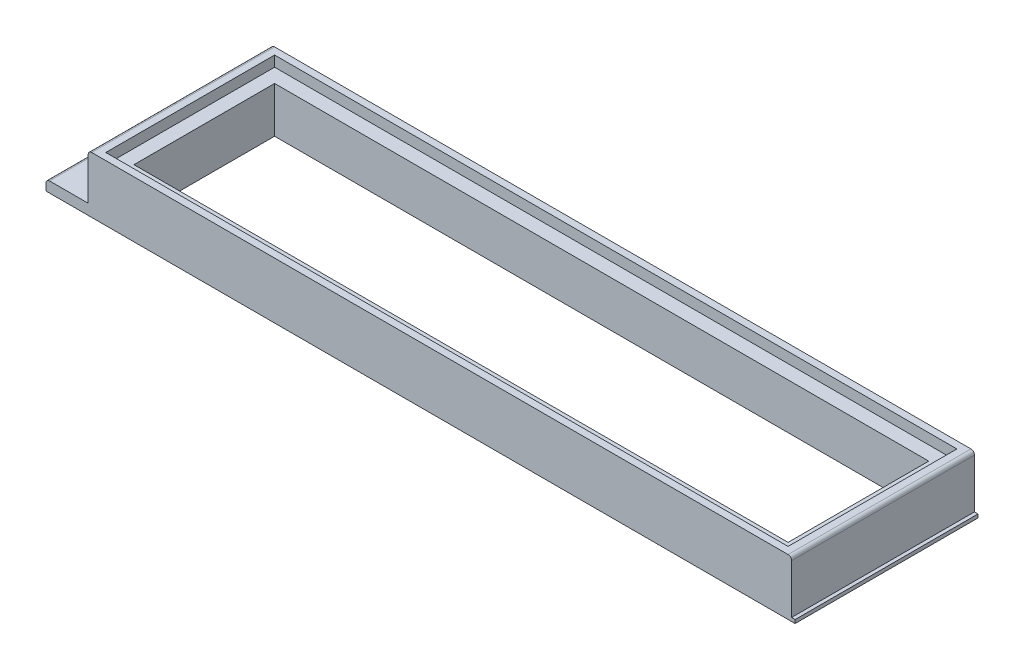
ISO-10303-21;
HEADER;
FILE_DESCRIPTION(('STEP AP214'),'2;1');
FILE_NAME('part.step','',(''),(''),'','','');
FILE_SCHEMA(('AUTOMOTIVE_DESIGN { 1 0 10303 214 1 1 1 1 }'));
ENDSEC;
DATA;
#1=APPLICATION_CONTEXT('core data for automotive mechanical design processes');
#2=APPLICATION_PROTOCOL_DEFINITION('international standard','automotive_design',2000,#1);
#3=PRODUCT_CONTEXT('',#1,'mechanical');
#4=PRODUCT('Part','Part','',(#3));
#5=PRODUCT_RELATED_PRODUCT_CATEGORY('part','',(#4));
#6=PRODUCT_DEFINITION_FORMATION('','',#4);
#7=PRODUCT_DEFINITION_CONTEXT('part definition',#1,'design');
#8=PRODUCT_DEFINITION('design','',#6,#7);
#9=PRODUCT_DEFINITION_SHAPE('','',#8);
#10=(LENGTH_UNIT() NAMED_UNIT(*) SI_UNIT(.MILLI.,.METRE.));
#11=(NAMED_UNIT(*) PLANE_ANGLE_UNIT() SI_UNIT($,.RADIAN.));
#12=(NAMED_UNIT(*) SI_UNIT($,.STERADIAN.) SOLID_ANGLE_UNIT());
#13=UNCERTAINTY_MEASURE_WITH_UNIT(LENGTH_MEASURE(1.E-05),#10,'distance_accuracy_value','');
#14=(GEOMETRIC_REPRESENTATION_CONTEXT(3) GLOBAL_UNCERTAINTY_ASSIGNED_CONTEXT((#13)) GLOBAL_UNIT_ASSIGNED_CONTEXT((#10,
#11,#12)) REPRESENTATION_CONTEXT('',''));
#15=CARTESIAN_POINT('',(0.,0.,0.));
#16=DIRECTION('',(0.,0.,1.));
#17=DIRECTION('',(1.,0.,0.));
#18=AXIS2_PLACEMENT_3D('',#15,#16,#17);
#19=CARTESIAN_POINT('',(9.5,-99.9249718538865,23.));
#20=DIRECTION('',(0.,0.,1.));
#21=DIRECTION('',(1.,0.,0.));
#22=AXIS2_PLACEMENT_3D('',#19,#20,#21);
#23=PLANE('',#22);
#24=DIRECTION('',(1.,0.,0.));
#25=VECTOR('',#24,1.);
#26=CARTESIAN_POINT('',(9.5,6.5,23.));
#27=LINE('',#26,#25);
#28=CARTESIAN_POINT('',(9.5,6.5,23.));
#29=VERTEX_POINT('',#28);
#30=CARTESIAN_POINT('',(102.5,6.5,23.));
#31=VERTEX_POINT('',#30);
#32=EDGE_CURVE('E171',#29,#31,#27,.T.);
#33=ORIENTED_EDGE('',*,*,#32,.T.);
#34=DIRECTION('',(0.,1.,0.));
#35=VECTOR('',#34,1.);
#36=CARTESIAN_POINT('',(102.5,-99.9249718538865,23.));
#37=LINE('',#36,#35);
#38=CARTESIAN_POINT('',(102.5,0.,23.));
#39=VERTEX_POINT('',#38);
#40=EDGE_CURVE('E179',#39,#31,#37,.T.);
#41=ORIENTED_EDGE('',*,*,#40,.F.);
#42=DIRECTION('',(1.,0.,0.));
#43=VECTOR('',#42,1.);
#44=CARTESIAN_POINT('',(9.5,0.,23.));
#45=LINE('',#44,#43);
#46=CARTESIAN_POINT('',(9.5,0.,23.));
#47=VERTEX_POINT('',#46);
#48=EDGE_CURVE('E192',#47,#39,#45,.T.);
#49=ORIENTED_EDGE('',*,*,#48,.F.);
#50=DIRECTION('',(0.,1.,0.));
#51=VECTOR('',#50,1.);
#52=CARTESIAN_POINT('',(9.5,-99.9249718538865,23.));
#53=LINE('',#52,#51);
#54=EDGE_CURVE('E182',#47,#29,#53,.T.);
#55=ORIENTED_EDGE('',*,*,#54,.T.);
#56=EDGE_LOOP('',(#33,#41,#49,#55));
#57=FACE_BOUND('',#56,.T.);
#58=ADVANCED_FACE('F38',(#57),#23,.F.);
#59=CARTESIAN_POINT('',(9.5,-99.9249718538865,3.));
#60=DIRECTION('',(-1.,0.,0.));
#61=DIRECTION('',(0.,0.,1.));
#62=AXIS2_PLACEMENT_3D('',#59,#60,#61);
#63=PLANE('',#62);
#64=DIRECTION('',(0.,0.,1.));
#65=VECTOR('',#64,1.);
#66=CARTESIAN_POINT('',(9.5,6.5,3.));
#67=LINE('',#66,#65);
#68=CARTESIAN_POINT('',(9.5,6.5,3.));
#69=VERTEX_POINT('',#68);
#70=EDGE_CURVE('E372',#69,#29,#67,.T.);
#71=ORIENTED_EDGE('',*,*,#70,.T.);
#72=ORIENTED_EDGE('',*,*,#54,.F.);
#73=DIRECTION('',(0.,0.,1.));
#74=VECTOR('',#73,1.);
#75=CARTESIAN_POINT('',(9.5,0.,3.));
#76=LINE('',#75,#74);
#77=CARTESIAN_POINT('',(9.5,0.,3.));
#78=VERTEX_POINT('',#77);
#79=EDGE_CURVE('E188',#78,#47,#76,.T.);
#80=ORIENTED_EDGE('',*,*,#79,.F.);
#81=DIRECTION('',(0.,1.,0.));
#82=VECTOR('',#81,1.);
#83=CARTESIAN_POINT('',(9.5,-99.9249718538865,3.));
#84=LINE('',#83,#82);
#85=EDGE_CURVE('E194',#78,#69,#84,.T.);
#86=ORIENTED_EDGE('',*,*,#85,.T.);
#87=EDGE_LOOP('',(#71,#72,#80,#86));
#88=FACE_BOUND('',#87,.T.);
#89=ADVANCED_FACE('F344',(#88),#63,.F.);
#90=CARTESIAN_POINT('',(102.5,-99.9249718538865,3.));
#91=DIRECTION('',(0.,0.,-1.));
#92=DIRECTION('',(-1.,0.,0.));
#93=AXIS2_PLACEMENT_3D('',#90,#91,#92);
#94=PLANE('',#93);
#95=DIRECTION('',(-1.,0.,0.));
#96=VECTOR('',#95,1.);
#97=CARTESIAN_POINT('',(102.5,6.5,3.));
#98=LINE('',#97,#96);
#99=CARTESIAN_POINT('',(102.5,6.50000000000001,3.));
#100=VERTEX_POINT('',#99);
#101=EDGE_CURVE('E62',#100,#69,#98,.T.);
#102=ORIENTED_EDGE('',*,*,#101,.T.);
#103=ORIENTED_EDGE('',*,*,#85,.F.);
#104=DIRECTION('',(-1.,0.,0.));
#105=VECTOR('',#104,1.);
#106=CARTESIAN_POINT('',(102.5,0.,3.));
#107=LINE('',#106,#105);
#108=CARTESIAN_POINT('',(102.5,0.,3.));
#109=VERTEX_POINT('',#108);
#110=EDGE_CURVE('E202',#109,#78,#107,.T.);
#111=ORIENTED_EDGE('',*,*,#110,.F.);
#112=DIRECTION('',(0.,1.,0.));
#113=VECTOR('',#112,1.);
#114=CARTESIAN_POINT('',(102.5,-99.9249718538865,3.));
#115=LINE('',#114,#113);
#116=EDGE_CURVE('E189',#109,#100,#115,.T.);
#117=ORIENTED_EDGE('',*,*,#116,.T.);
#118=EDGE_LOOP('',(#102,#103,#111,#117));
#119=FACE_BOUND('',#118,.T.);
#120=ADVANCED_FACE('F346',(#119),#94,.F.);
#121=CARTESIAN_POINT('',(102.5,-99.9249718538865,23.));
#122=DIRECTION('',(1.,0.,0.));
#123=DIRECTION('',(0.,0.,-1.));
#124=AXIS2_PLACEMENT_3D('',#121,#122,#123);
#125=PLANE('',#124);
#126=DIRECTION('',(0.,0.,-1.));
#127=VECTOR('',#126,1.);
#128=CARTESIAN_POINT('',(102.5,6.5,23.));
#129=LINE('',#128,#127);
#130=EDGE_CURVE('E167',#31,#100,#129,.T.);
#131=ORIENTED_EDGE('',*,*,#130,.T.);
#132=ORIENTED_EDGE('',*,*,#116,.F.);
#133=DIRECTION('',(0.,0.,-1.));
#134=VECTOR('',#133,1.);
#135=CARTESIAN_POINT('',(102.5,0.,23.));
#136=LINE('',#135,#134);
#137=EDGE_CURVE('E186',#39,#109,#136,.T.);
#138=ORIENTED_EDGE('',*,*,#137,.F.);
#139=ORIENTED_EDGE('',*,*,#40,.T.);
#140=EDGE_LOOP('',(#131,#132,#138,#139));
#141=FACE_BOUND('',#140,.T.);
#142=ADVANCED_FACE('F184',(#141),#125,.F.);
#143=CARTESIAN_POINT('',(0.,8.,0.));
#144=DIRECTION('',(0.,-1.,0.));
#145=DIRECTION('',(0.,0.,-1.));
#146=AXIS2_PLACEMENT_3D('',#143,#144,#145);
#147=PLANE('',#146);
#148=DIRECTION('',(1.,0.,0.));
#149=VECTOR('',#148,1.);
#150=CARTESIAN_POINT('',(7.5,8.,25.));
#151=LINE('',#150,#149);
#152=CARTESIAN_POINT('',(7.5,8.,25.));
#153=VERTEX_POINT('',#152);
#154=CARTESIAN_POINT('',(104.5,8.,25.));
#155=VERTEX_POINT('',#154);
#156=EDGE_CURVE('E368',#153,#155,#151,.T.);
#157=ORIENTED_EDGE('',*,*,#156,.F.);
#158=DIRECTION('',(0.,0.,1.));
#159=VECTOR('',#158,1.);
#160=CARTESIAN_POINT('',(7.5,8.,1.));
#161=LINE('',#160,#159);
#162=CARTESIAN_POINT('',(7.5,8.,1.));
#163=VERTEX_POINT('',#162);
#164=EDGE_CURVE('E54',#163,#153,#161,.T.);
#165=ORIENTED_EDGE('',*,*,#164,.F.);
#166=DIRECTION('',(-1.,0.,0.));
#167=VECTOR('',#166,1.);
#168=CARTESIAN_POINT('',(7.5,8.,1.));
#169=LINE('',#168,#167);
#170=CARTESIAN_POINT('',(104.5,8.,1.));
#171=VERTEX_POINT('',#170);
#172=EDGE_CURVE('E361',#171,#163,#169,.T.);
#173=ORIENTED_EDGE('',*,*,#172,.F.);
#174=DIRECTION('',(0.,0.,-1.));
#175=VECTOR('',#174,1.);
#176=CARTESIAN_POINT('',(104.5,8.,1.));
#177=LINE('',#176,#175);
#178=EDGE_CURVE('E365',#155,#171,#177,.T.);
#179=ORIENTED_EDGE('',*,*,#178,.F.);
#180=EDGE_LOOP('',(#157,#165,#173,#179));
#181=FACE_BOUND('',#180,.T.);
#182=DIRECTION('',(1.,0.,0.));
#183=VECTOR('',#182,1.);
#184=CARTESIAN_POINT('',(0.,8.,0.));
#185=LINE('',#184,#183);
#186=CARTESIAN_POINT('',(6.5,8.,0.));
#187=VERTEX_POINT('',#186);
#188=CARTESIAN_POINT('',(105.5,8.,0.));
#189=VERTEX_POINT('',#188);
#190=EDGE_CURVE('E234',#187,#189,#185,.T.);
#191=ORIENTED_EDGE('',*,*,#190,.F.);
#192=DIRECTION('',(0.,0.,1.));
#193=VECTOR('',#192,1.);
#194=CARTESIAN_POINT('',(6.5,8.,0.));
#195=LINE('',#194,#193);
#196=CARTESIAN_POINT('',(6.5,8.,26.));
#197=VERTEX_POINT('',#196);
#198=EDGE_CURVE('E261',#187,#197,#195,.T.);
#199=ORIENTED_EDGE('',*,*,#198,.T.);
#200=DIRECTION('',(1.,0.,0.));
#201=VECTOR('',#200,1.);
#202=CARTESIAN_POINT('',(0.,8.,26.));
#203=LINE('',#202,#201);
#204=CARTESIAN_POINT('',(105.5,8.,26.));
#205=VERTEX_POINT('',#204);
#206=EDGE_CURVE('E237',#197,#205,#203,.T.);
#207=ORIENTED_EDGE('',*,*,#206,.T.);
#208=DIRECTION('',(0.,0.,1.));
#209=VECTOR('',#208,1.);
#210=CARTESIAN_POINT('',(105.5,8.,0.));
#211=LINE('',#210,#209);
#212=EDGE_CURVE('E254',#205,#189,#211,.F.);
#213=ORIENTED_EDGE('',*,*,#212,.T.);
#214=EDGE_LOOP('',(#191,#199,#207,#213));
#215=FACE_BOUND('',#214,.T.);
#216=ADVANCED_FACE('F314',(#181,#215),#147,.F.);
#217=CARTESIAN_POINT('',(0.,8.,0.));
#218=DIRECTION('',(0.,0.,-1.));
#219=DIRECTION('',(-1.,0.,0.));
#220=AXIS2_PLACEMENT_3D('',#217,#218,#219);
#221=PLANE('',#220);
#222=DIRECTION('',(0.,1.,0.));
#223=VECTOR('',#222,1.);
#224=CARTESIAN_POINT('',(6.,8.,0.));
#225=LINE('',#224,#223);
#226=CARTESIAN_POINT('',(6.,1.5,0.));
#227=VERTEX_POINT('',#226);
#228=CARTESIAN_POINT('',(6.,7.5,0.));
#229=VERTEX_POINT('',#228);
#230=EDGE_CURVE('E225',#227,#229,#225,.T.);
#231=ORIENTED_EDGE('',*,*,#230,.T.);
#232=CARTESIAN_POINT('',(6.5,7.5,0.));
#233=DIRECTION('',(0.,0.,-1.));
#234=DIRECTION('',(-1.,0.,0.));
#235=AXIS2_PLACEMENT_3D('',#232,#233,#234);
#236=CIRCLE('',#235,0.5);
#237=EDGE_CURVE('E276',#229,#187,#236,.T.);
#238=ORIENTED_EDGE('',*,*,#237,.T.);
#239=ORIENTED_EDGE('',*,*,#190,.T.);
#240=CARTESIAN_POINT('',(105.5,7.5,0.));
#241=DIRECTION('',(0.,0.,-1.));
#242=DIRECTION('',(-1.,0.,0.));
#243=AXIS2_PLACEMENT_3D('',#240,#241,#242);
#244=CIRCLE('',#243,0.5);
#245=CARTESIAN_POINT('',(106.,7.5,0.));
#246=VERTEX_POINT('',#245);
#247=EDGE_CURVE('E272',#189,#246,#244,.T.);
#248=ORIENTED_EDGE('',*,*,#247,.T.);
#249=DIRECTION('',(0.,-1.,0.));
#250=VECTOR('',#249,1.);
#251=CARTESIAN_POINT('',(106.,8.,0.));
#252=LINE('',#251,#250);
#253=CARTESIAN_POINT('',(106.,0.5,0.));
#254=VERTEX_POINT('',#253);
#255=EDGE_CURVE('E205',#246,#254,#252,.T.);
#256=ORIENTED_EDGE('',*,*,#255,.T.);
#257=DIRECTION('',(1.,0.,0.));
#258=VECTOR('',#257,1.);
#259=CARTESIAN_POINT('',(106.5,0.5,0.));
#260=LINE('',#259,#258);
#261=CARTESIAN_POINT('',(106.5,0.5,0.));
#262=VERTEX_POINT('',#261);
#263=EDGE_CURVE('E207',#254,#262,#260,.T.);
#264=ORIENTED_EDGE('',*,*,#263,.T.);
#265=DIRECTION('',(0.,-1.,0.));
#266=VECTOR('',#265,1.);
#267=CARTESIAN_POINT('',(106.5,8.,0.));
#268=LINE('',#267,#266);
#269=CARTESIAN_POINT('',(106.5,0.,0.));
#270=VERTEX_POINT('',#269);
#271=EDGE_CURVE('E241',#262,#270,#268,.T.);
#272=ORIENTED_EDGE('',*,*,#271,.T.);
#273=DIRECTION('',(1.,0.,0.));
#274=VECTOR('',#273,1.);
#275=CARTESIAN_POINT('',(0.,0.,0.));
#276=LINE('',#275,#274);
#277=CARTESIAN_POINT('',(0.,0.,0.));
#278=VERTEX_POINT('',#277);
#279=EDGE_CURVE('E219',#278,#270,#276,.T.);
#280=ORIENTED_EDGE('',*,*,#279,.F.);
#281=DIRECTION('',(0.,-1.,0.));
#282=VECTOR('',#281,1.);
#283=CARTESIAN_POINT('',(0.,8.,0.));
#284=LINE('',#283,#282);
#285=CARTESIAN_POINT('',(0.,1.,0.));
#286=VERTEX_POINT('',#285);
#287=EDGE_CURVE('E252',#286,#278,#284,.T.);
#288=ORIENTED_EDGE('',*,*,#287,.F.);
#289=CARTESIAN_POINT('',(0.5,1.,0.));
#290=DIRECTION('',(0.,0.,-1.));
#291=DIRECTION('',(-1.,0.,0.));
#292=AXIS2_PLACEMENT_3D('',#289,#290,#291);
#293=CIRCLE('',#292,0.5);
#294=CARTESIAN_POINT('',(0.5,1.5,0.));
#295=VERTEX_POINT('',#294);
#296=EDGE_CURVE('E274',#286,#295,#293,.T.);
#297=ORIENTED_EDGE('',*,*,#296,.T.);
#298=DIRECTION('',(1.,0.,0.));
#299=VECTOR('',#298,1.);
#300=CARTESIAN_POINT('',(0.,1.5,0.));
#301=LINE('',#300,#299);
#302=EDGE_CURVE('E229',#295,#227,#301,.T.);
#303=ORIENTED_EDGE('',*,*,#302,.T.);
#304=EDGE_LOOP('',(#231,#238,#239,#248,#256,#264,#272,#280,#288,#297,#303));
#305=FACE_BOUND('',#304,.T.);
#306=ADVANCED_FACE('F291',(#305),#221,.T.);
#307=CARTESIAN_POINT('',(0.,8.,0.));
#308=DIRECTION('',(1.,0.,0.));
#309=DIRECTION('',(0.,0.,-1.));
#310=AXIS2_PLACEMENT_3D('',#307,#308,#309);
#311=PLANE('',#310);
#312=DIRECTION('',(0.,-1.,0.));
#313=VECTOR('',#312,1.);
#314=CARTESIAN_POINT('',(0.,8.,26.));
#315=LINE('',#314,#313);
#316=CARTESIAN_POINT('',(0.,1.,26.));
#317=VERTEX_POINT('',#316);
#318=CARTESIAN_POINT('',(0.,0.,26.));
#319=VERTEX_POINT('',#318);
#320=EDGE_CURVE('E255',#317,#319,#315,.T.);
#321=ORIENTED_EDGE('',*,*,#320,.F.);
#322=DIRECTION('',(0.,0.,1.));
#323=VECTOR('',#322,1.);
#324=CARTESIAN_POINT('',(0.,1.,0.));
#325=LINE('',#324,#323);
#326=EDGE_CURVE('E47',#317,#286,#325,.F.);
#327=ORIENTED_EDGE('',*,*,#326,.T.);
#328=ORIENTED_EDGE('',*,*,#287,.T.);
#329=DIRECTION('',(0.,0.,1.));
#330=VECTOR('',#329,1.);
#331=CARTESIAN_POINT('',(0.,0.,0.));
#332=LINE('',#331,#330);
#333=EDGE_CURVE('E238',#278,#319,#332,.T.);
#334=ORIENTED_EDGE('',*,*,#333,.T.);
#335=EDGE_LOOP('',(#321,#327,#328,#334));
#336=FACE_BOUND('',#335,.T.);
#337=ADVANCED_FACE('F285',(#336),#311,.F.);
#338=CARTESIAN_POINT('',(0.,8.,26.));
#339=DIRECTION('',(0.,0.,-1.));
#340=DIRECTION('',(-1.,0.,0.));
#341=AXIS2_PLACEMENT_3D('',#338,#339,#340);
#342=PLANE('',#341);
#343=ORIENTED_EDGE('',*,*,#206,.F.);
#344=CARTESIAN_POINT('',(6.5,7.5,26.));
#345=DIRECTION('',(0.,0.,-1.));
#346=DIRECTION('',(-1.,0.,0.));
#347=AXIS2_PLACEMENT_3D('',#344,#345,#346);
#348=CIRCLE('',#347,0.5);
#349=CARTESIAN_POINT('',(6.,7.5,26.));
#350=VERTEX_POINT('',#349);
#351=EDGE_CURVE('E268',#197,#350,#348,.F.);
#352=ORIENTED_EDGE('',*,*,#351,.T.);
#353=DIRECTION('',(0.,1.,0.));
#354=VECTOR('',#353,1.);
#355=CARTESIAN_POINT('',(6.,8.,26.));
#356=LINE('',#355,#354);
#357=CARTESIAN_POINT('',(6.,1.5,26.));
#358=VERTEX_POINT('',#357);
#359=EDGE_CURVE('E226',#358,#350,#356,.T.);
#360=ORIENTED_EDGE('',*,*,#359,.F.);
#361=DIRECTION('',(1.,0.,0.));
#362=VECTOR('',#361,1.);
#363=CARTESIAN_POINT('',(0.,1.5,26.));
#364=LINE('',#363,#362);
#365=CARTESIAN_POINT('',(0.500000000000014,1.5,26.));
#366=VERTEX_POINT('',#365);
#367=EDGE_CURVE('E214',#366,#358,#364,.T.);
#368=ORIENTED_EDGE('',*,*,#367,.F.);
#369=CARTESIAN_POINT('',(0.500000000000014,1.,26.));
#370=DIRECTION('',(0.,0.,-1.));
#371=DIRECTION('',(-1.,0.,0.));
#372=AXIS2_PLACEMENT_3D('',#369,#370,#371);
#373=CIRCLE('',#372,0.5);
#374=EDGE_CURVE('E266',#366,#317,#373,.F.);
#375=ORIENTED_EDGE('',*,*,#374,.T.);
#376=ORIENTED_EDGE('',*,*,#320,.T.);
#377=DIRECTION('',(1.,0.,0.));
#378=VECTOR('',#377,1.);
#379=CARTESIAN_POINT('',(0.,0.,26.));
#380=LINE('',#379,#378);
#381=CARTESIAN_POINT('',(106.5,0.,26.));
#382=VERTEX_POINT('',#381);
#383=EDGE_CURVE('E247',#319,#382,#380,.T.);
#384=ORIENTED_EDGE('',*,*,#383,.T.);
#385=DIRECTION('',(0.,-1.,0.));
#386=VECTOR('',#385,1.);
#387=CARTESIAN_POINT('',(106.5,8.,26.));
#388=LINE('',#387,#386);
#389=CARTESIAN_POINT('',(106.5,0.5,26.));
#390=VERTEX_POINT('',#389);
#391=EDGE_CURVE('E257',#390,#382,#388,.T.);
#392=ORIENTED_EDGE('',*,*,#391,.F.);
#393=DIRECTION('',(1.,0.,0.));
#394=VECTOR('',#393,1.);
#395=CARTESIAN_POINT('',(106.5,0.5,26.));
#396=LINE('',#395,#394);
#397=CARTESIAN_POINT('',(106.,0.5,26.));
#398=VERTEX_POINT('',#397);
#399=EDGE_CURVE('E208',#398,#390,#396,.T.);
#400=ORIENTED_EDGE('',*,*,#399,.F.);
#401=DIRECTION('',(0.,-1.,0.));
#402=VECTOR('',#401,1.);
#403=CARTESIAN_POINT('',(106.,8.,26.));
#404=LINE('',#403,#402);
#405=CARTESIAN_POINT('',(106.,7.5,26.));
#406=VERTEX_POINT('',#405);
#407=EDGE_CURVE('E212',#406,#398,#404,.T.);
#408=ORIENTED_EDGE('',*,*,#407,.F.);
#409=CARTESIAN_POINT('',(105.5,7.5,26.));
#410=DIRECTION('',(0.,0.,-1.));
#411=DIRECTION('',(-1.,0.,0.));
#412=AXIS2_PLACEMENT_3D('',#409,#410,#411);
#413=CIRCLE('',#412,0.5);
#414=EDGE_CURVE('E264',#406,#205,#413,.F.);
#415=ORIENTED_EDGE('',*,*,#414,.T.);
#416=EDGE_LOOP('',(#343,#352,#360,#368,#375,#376,#384,#392,#400,#408,#415));
#417=FACE_BOUND('',#416,.T.);
#418=ADVANCED_FACE('F302',(#417),#342,.F.);
#419=CARTESIAN_POINT('',(106.5,8.,0.));
#420=DIRECTION('',(1.,0.,0.));
#421=DIRECTION('',(0.,0.,-1.));
#422=AXIS2_PLACEMENT_3D('',#419,#420,#421);
#423=PLANE('',#422);
#424=DIRECTION('',(0.,0.,1.));
#425=VECTOR('',#424,1.);
#426=CARTESIAN_POINT('',(106.5,0.5,0.));
#427=LINE('',#426,#425);
#428=EDGE_CURVE('E216',#262,#390,#427,.T.);
#429=ORIENTED_EDGE('',*,*,#428,.T.);
#430=ORIENTED_EDGE('',*,*,#391,.T.);
#431=DIRECTION('',(0.,0.,1.));
#432=VECTOR('',#431,1.);
#433=CARTESIAN_POINT('',(106.5,0.,0.));
#434=LINE('',#433,#432);
#435=EDGE_CURVE('E244',#270,#382,#434,.T.);
#436=ORIENTED_EDGE('',*,*,#435,.F.);
#437=ORIENTED_EDGE('',*,*,#271,.F.);
#438=EDGE_LOOP('',(#429,#430,#436,#437));
#439=FACE_BOUND('',#438,.T.);
#440=ADVANCED_FACE('F330',(#439),#423,.T.);
#441=CARTESIAN_POINT('',(0.,0.,0.));
#442=DIRECTION('',(0.,-1.,0.));
#443=DIRECTION('',(0.,0.,-1.));
#444=AXIS2_PLACEMENT_3D('',#441,#442,#443);
#445=PLANE('',#444);
#446=CARTESIAN_POINT('',(3.,0.,13.));
#447=DIRECTION('',(0.,-1.,0.));
#448=DIRECTION('',(0.,0.,-1.));
#449=AXIS2_PLACEMENT_3D('',#446,#447,#448);
#450=CIRCLE('',#449,0.899999999999993);
#451=CARTESIAN_POINT('',(3.,0.,12.1));
#452=VERTEX_POINT('',#451);
#453=EDGE_CURVE('E42',#452,#452,#450,.T.);
#454=ORIENTED_EDGE('',*,*,#453,.F.);
#455=EDGE_LOOP('',(#454));
#456=FACE_BOUND('',#455,.T.);
#457=ORIENTED_EDGE('',*,*,#279,.T.);
#458=ORIENTED_EDGE('',*,*,#435,.T.);
#459=ORIENTED_EDGE('',*,*,#383,.F.);
#460=ORIENTED_EDGE('',*,*,#333,.F.);
#461=EDGE_LOOP('',(#457,#458,#459,#460));
#462=FACE_BOUND('',#461,.T.);
#463=ORIENTED_EDGE('',*,*,#79,.T.);
#464=ORIENTED_EDGE('',*,*,#48,.T.);
#465=ORIENTED_EDGE('',*,*,#137,.T.);
#466=ORIENTED_EDGE('',*,*,#110,.T.);
#467=EDGE_LOOP('',(#463,#464,#465,#466));
#468=FACE_BOUND('',#467,.T.);
#469=ADVANCED_FACE('F334',(#456,#462,#468),#445,.T.);
#470=CARTESIAN_POINT('',(6.,8.,0.));
#471=DIRECTION('',(1.,0.,0.));
#472=DIRECTION('',(0.,1.,0.));
#473=AXIS2_PLACEMENT_3D('',#470,#471,#472);
#474=PLANE('',#473);
#475=ORIENTED_EDGE('',*,*,#359,.T.);
#476=DIRECTION('',(0.,0.,1.));
#477=VECTOR('',#476,1.);
#478=CARTESIAN_POINT('',(6.,7.5,0.));
#479=LINE('',#478,#477);
#480=EDGE_CURVE('E270',#350,#229,#479,.F.);
#481=ORIENTED_EDGE('',*,*,#480,.T.);
#482=ORIENTED_EDGE('',*,*,#230,.F.);
#483=DIRECTION('',(0.,0.,1.));
#484=VECTOR('',#483,1.);
#485=CARTESIAN_POINT('',(6.,1.5,0.));
#486=LINE('',#485,#484);
#487=EDGE_CURVE('E222',#227,#358,#486,.T.);
#488=ORIENTED_EDGE('',*,*,#487,.T.);
#489=EDGE_LOOP('',(#475,#481,#482,#488));
#490=FACE_BOUND('',#489,.T.);
#491=ADVANCED_FACE('F305',(#490),#474,.F.);
#492=CARTESIAN_POINT('',(0.,1.5,0.));
#493=DIRECTION('',(0.,-1.,0.));
#494=DIRECTION('',(1.,0.,0.));
#495=AXIS2_PLACEMENT_3D('',#492,#493,#494);
#496=PLANE('',#495);
#497=CARTESIAN_POINT('',(3.,1.5,13.));
#498=DIRECTION('',(0.,1.,0.));
#499=DIRECTION('',(0.,0.,1.));
#500=AXIS2_PLACEMENT_3D('',#497,#498,#499);
#501=CIRCLE('',#500,1.8);
#502=CARTESIAN_POINT('',(3.,1.5,14.8));
#503=VERTEX_POINT('',#502);
#504=EDGE_CURVE('E198',#503,#503,#501,.T.);
#505=ORIENTED_EDGE('',*,*,#504,.F.);
#506=EDGE_LOOP('',(#505));
#507=FACE_BOUND('',#506,.T.);
#508=ORIENTED_EDGE('',*,*,#302,.F.);
#509=DIRECTION('',(0.,0.,1.));
#510=VECTOR('',#509,1.);
#511=CARTESIAN_POINT('',(0.5,1.5,0.));
#512=LINE('',#511,#510);
#513=EDGE_CURVE('E278',#295,#366,#512,.T.);
#514=ORIENTED_EDGE('',*,*,#513,.T.);
#515=ORIENTED_EDGE('',*,*,#367,.T.);
#516=ORIENTED_EDGE('',*,*,#487,.F.);
#517=EDGE_LOOP('',(#508,#514,#515,#516));
#518=FACE_BOUND('',#517,.T.);
#519=ADVANCED_FACE('F297',(#507,#518),#496,.F.);
#520=CARTESIAN_POINT('',(106.5,0.5,0.));
#521=DIRECTION('',(0.,-1.,0.));
#522=DIRECTION('',(1.,0.,0.));
#523=AXIS2_PLACEMENT_3D('',#520,#521,#522);
#524=PLANE('',#523);
#525=ORIENTED_EDGE('',*,*,#399,.T.);
#526=ORIENTED_EDGE('',*,*,#428,.F.);
#527=ORIENTED_EDGE('',*,*,#263,.F.);
#528=DIRECTION('',(0.,0.,1.));
#529=VECTOR('',#528,1.);
#530=CARTESIAN_POINT('',(106.,0.5,0.));
#531=LINE('',#530,#529);
#532=EDGE_CURVE('E211',#254,#398,#531,.T.);
#533=ORIENTED_EDGE('',*,*,#532,.T.);
#534=EDGE_LOOP('',(#525,#526,#527,#533));
#535=FACE_BOUND('',#534,.T.);
#536=ADVANCED_FACE('F326',(#535),#524,.F.);
#537=CARTESIAN_POINT('',(106.,8.,0.));
#538=DIRECTION('',(-1.,0.,0.));
#539=DIRECTION('',(0.,0.,1.));
#540=AXIS2_PLACEMENT_3D('',#537,#538,#539);
#541=PLANE('',#540);
#542=ORIENTED_EDGE('',*,*,#255,.F.);
#543=DIRECTION('',(0.,0.,1.));
#544=VECTOR('',#543,1.);
#545=CARTESIAN_POINT('',(106.,7.5,0.));
#546=LINE('',#545,#544);
#547=EDGE_CURVE('E11',#246,#406,#546,.T.);
#548=ORIENTED_EDGE('',*,*,#547,.T.);
#549=ORIENTED_EDGE('',*,*,#407,.T.);
#550=ORIENTED_EDGE('',*,*,#532,.F.);
#551=EDGE_LOOP('',(#542,#548,#549,#550));
#552=FACE_BOUND('',#551,.T.);
#553=ADVANCED_FACE('F321',(#552),#541,.F.);
#554=CARTESIAN_POINT('',(6.5,7.5,0.));
#555=DIRECTION('',(0.,0.,1.));
#556=DIRECTION('',(1.,0.,0.));
#557=AXIS2_PLACEMENT_3D('',#554,#555,#556);
#558=CYLINDRICAL_SURFACE('',#557,0.5);
#559=ORIENTED_EDGE('',*,*,#237,.F.);
#560=ORIENTED_EDGE('',*,*,#480,.F.);
#561=ORIENTED_EDGE('',*,*,#351,.F.);
#562=ORIENTED_EDGE('',*,*,#198,.F.);
#563=EDGE_LOOP('',(#559,#560,#561,#562));
#564=FACE_BOUND('',#563,.T.);
#565=ADVANCED_FACE('F309',(#564),#558,.T.);
#566=CARTESIAN_POINT('',(0.5,1.,0.));
#567=DIRECTION('',(0.,0.,1.));
#568=DIRECTION('',(1.,0.,0.));
#569=AXIS2_PLACEMENT_3D('',#566,#567,#568);
#570=CYLINDRICAL_SURFACE('',#569,0.5);
#571=ORIENTED_EDGE('',*,*,#296,.F.);
#572=ORIENTED_EDGE('',*,*,#326,.F.);
#573=ORIENTED_EDGE('',*,*,#374,.F.);
#574=ORIENTED_EDGE('',*,*,#513,.F.);
#575=EDGE_LOOP('',(#571,#572,#573,#574));
#576=FACE_BOUND('',#575,.T.);
#577=ADVANCED_FACE('F294',(#576),#570,.T.);
#578=CARTESIAN_POINT('',(105.5,7.5,0.));
#579=DIRECTION('',(0.,0.,1.));
#580=DIRECTION('',(1.,0.,0.));
#581=AXIS2_PLACEMENT_3D('',#578,#579,#580);
#582=CYLINDRICAL_SURFACE('',#581,0.5);
#583=ORIENTED_EDGE('',*,*,#247,.F.);
#584=ORIENTED_EDGE('',*,*,#212,.F.);
#585=ORIENTED_EDGE('',*,*,#414,.F.);
#586=ORIENTED_EDGE('',*,*,#547,.F.);
#587=EDGE_LOOP('',(#583,#584,#585,#586));
#588=FACE_BOUND('',#587,.T.);
#589=ADVANCED_FACE('F40',(#588),#582,.T.);
#590=CARTESIAN_POINT('',(3.,1.5,13.));
#591=DIRECTION('',(0.,1.,0.));
#592=DIRECTION('',(0.,0.,1.));
#593=AXIS2_PLACEMENT_3D('',#590,#591,#592);
#594=CYLINDRICAL_SURFACE('',#593,0.899999999999993);
#595=ORIENTED_EDGE('',*,*,#453,.T.);
#596=EDGE_LOOP('',(#595));
#597=FACE_BOUND('',#596,.T.);
#598=CARTESIAN_POINT('',(3.,0.599999999999999,13.));
#599=DIRECTION('',(0.,1.,0.));
#600=DIRECTION('',(0.,0.,1.));
#601=AXIS2_PLACEMENT_3D('',#598,#599,#600);
#602=CIRCLE('',#601,0.899999999999998);
#603=CARTESIAN_POINT('',(3.,0.599999999999999,13.9));
#604=VERTEX_POINT('',#603);
#605=EDGE_CURVE('E201',#604,#604,#602,.T.);
#606=ORIENTED_EDGE('',*,*,#605,.T.);
#607=EDGE_LOOP('',(#606));
#608=FACE_BOUND('',#607,.T.);
#609=ADVANCED_FACE('F419',(#597,#608),#594,.F.);
#610=CARTESIAN_POINT('',(3.,1.5,13.));
#611=DIRECTION('',(0.,1.,0.));
#612=DIRECTION('',(0.,0.,1.));
#613=AXIS2_PLACEMENT_3D('',#610,#611,#612);
#614=CONICAL_SURFACE('',#613,1.8,0.785398163397447);
#615=ORIENTED_EDGE('',*,*,#605,.F.);
#616=EDGE_LOOP('',(#615));
#617=FACE_BOUND('',#616,.T.);
#618=ORIENTED_EDGE('',*,*,#504,.T.);
#619=EDGE_LOOP('',(#618));
#620=FACE_BOUND('',#619,.T.);
#621=ADVANCED_FACE('F416',(#617,#620),#614,.F.);
#622=CARTESIAN_POINT('',(7.5,6.5,1.));
#623=DIRECTION('',(-1.,0.,0.));
#624=DIRECTION('',(0.,0.,1.));
#625=AXIS2_PLACEMENT_3D('',#622,#623,#624);
#626=PLANE('',#625);
#627=ORIENTED_EDGE('',*,*,#164,.T.);
#628=DIRECTION('',(0.,1.,0.));
#629=VECTOR('',#628,1.);
#630=CARTESIAN_POINT('',(7.5,6.5,25.));
#631=LINE('',#630,#629);
#632=CARTESIAN_POINT('',(7.5,6.5,25.));
#633=VERTEX_POINT('',#632);
#634=EDGE_CURVE('E353',#633,#153,#631,.T.);
#635=ORIENTED_EDGE('',*,*,#634,.F.);
#636=DIRECTION('',(0.,0.,1.));
#637=VECTOR('',#636,1.);
#638=CARTESIAN_POINT('',(7.5,6.5,1.));
#639=LINE('',#638,#637);
#640=CARTESIAN_POINT('',(7.5,6.5,1.));
#641=VERTEX_POINT('',#640);
#642=EDGE_CURVE('E364',#641,#633,#639,.T.);
#643=ORIENTED_EDGE('',*,*,#642,.F.);
#644=DIRECTION('',(0.,1.,0.));
#645=VECTOR('',#644,1.);
#646=CARTESIAN_POINT('',(7.5,6.5,1.));
#647=LINE('',#646,#645);
#648=EDGE_CURVE('E347',#641,#163,#647,.T.);
#649=ORIENTED_EDGE('',*,*,#648,.T.);
#650=EDGE_LOOP('',(#627,#635,#643,#649));
#651=FACE_BOUND('',#650,.T.);
#652=ADVANCED_FACE('F387',(#651),#626,.F.);
#653=CARTESIAN_POINT('',(7.5,6.5,1.));
#654=DIRECTION('',(0.,0.,-1.));
#655=DIRECTION('',(-1.,0.,0.));
#656=AXIS2_PLACEMENT_3D('',#653,#654,#655);
#657=PLANE('',#656);
#658=ORIENTED_EDGE('',*,*,#172,.T.);
#659=ORIENTED_EDGE('',*,*,#648,.F.);
#660=DIRECTION('',(-1.,0.,0.));
#661=VECTOR('',#660,1.);
#662=CARTESIAN_POINT('',(7.5,6.5,1.));
#663=LINE('',#662,#661);
#664=CARTESIAN_POINT('',(104.5,6.5,1.));
#665=VERTEX_POINT('',#664);
#666=EDGE_CURVE('E356',#665,#641,#663,.T.);
#667=ORIENTED_EDGE('',*,*,#666,.F.);
#668=DIRECTION('',(0.,1.,0.));
#669=VECTOR('',#668,1.);
#670=CARTESIAN_POINT('',(104.5,6.5,1.));
#671=LINE('',#670,#669);
#672=EDGE_CURVE('E358',#665,#171,#671,.T.);
#673=ORIENTED_EDGE('',*,*,#672,.T.);
#674=EDGE_LOOP('',(#658,#659,#667,#673));
#675=FACE_BOUND('',#674,.T.);
#676=ADVANCED_FACE('F396',(#675),#657,.F.);
#677=CARTESIAN_POINT('',(104.5,6.5,1.));
#678=DIRECTION('',(1.,0.,0.));
#679=DIRECTION('',(0.,0.,-1.));
#680=AXIS2_PLACEMENT_3D('',#677,#678,#679);
#681=PLANE('',#680);
#682=ORIENTED_EDGE('',*,*,#178,.T.);
#683=ORIENTED_EDGE('',*,*,#672,.F.);
#684=DIRECTION('',(0.,0.,-1.));
#685=VECTOR('',#684,1.);
#686=CARTESIAN_POINT('',(104.5,6.5,1.));
#687=LINE('',#686,#685);
#688=CARTESIAN_POINT('',(104.5,6.5,25.));
#689=VERTEX_POINT('',#688);
#690=EDGE_CURVE('E375',#689,#665,#687,.T.);
#691=ORIENTED_EDGE('',*,*,#690,.F.);
#692=DIRECTION('',(0.,1.,0.));
#693=VECTOR('',#692,1.);
#694=CARTESIAN_POINT('',(104.5,6.5,25.));
#695=LINE('',#694,#693);
#696=EDGE_CURVE('E355',#689,#155,#695,.T.);
#697=ORIENTED_EDGE('',*,*,#696,.T.);
#698=EDGE_LOOP('',(#682,#683,#691,#697));
#699=FACE_BOUND('',#698,.T.);
#700=ADVANCED_FACE('F394',(#699),#681,.F.);
#701=CARTESIAN_POINT('',(7.5,6.5,25.));
#702=DIRECTION('',(0.,0.,1.));
#703=DIRECTION('',(1.,0.,0.));
#704=AXIS2_PLACEMENT_3D('',#701,#702,#703);
#705=PLANE('',#704);
#706=ORIENTED_EDGE('',*,*,#156,.T.);
#707=ORIENTED_EDGE('',*,*,#696,.F.);
#708=DIRECTION('',(1.,0.,0.));
#709=VECTOR('',#708,1.);
#710=CARTESIAN_POINT('',(7.5,6.5,25.));
#711=LINE('',#710,#709);
#712=EDGE_CURVE('E378',#633,#689,#711,.T.);
#713=ORIENTED_EDGE('',*,*,#712,.F.);
#714=ORIENTED_EDGE('',*,*,#634,.T.);
#715=EDGE_LOOP('',(#706,#707,#713,#714));
#716=FACE_BOUND('',#715,.T.);
#717=ADVANCED_FACE('F390',(#716),#705,.F.);
#718=CARTESIAN_POINT('',(0.,6.5,0.));
#719=DIRECTION('',(0.,1.,0.));
#720=DIRECTION('',(0.,0.,1.));
#721=AXIS2_PLACEMENT_3D('',#718,#719,#720);
#722=PLANE('',#721);
#723=ORIENTED_EDGE('',*,*,#70,.F.);
#724=ORIENTED_EDGE('',*,*,#101,.F.);
#725=ORIENTED_EDGE('',*,*,#130,.F.);
#726=ORIENTED_EDGE('',*,*,#32,.F.);
#727=EDGE_LOOP('',(#723,#724,#725,#726));
#728=FACE_BOUND('',#727,.T.);
#729=ORIENTED_EDGE('',*,*,#642,.T.);
#730=ORIENTED_EDGE('',*,*,#712,.T.);
#731=ORIENTED_EDGE('',*,*,#690,.T.);
#732=ORIENTED_EDGE('',*,*,#666,.T.);
#733=EDGE_LOOP('',(#729,#730,#731,#732));
#734=FACE_BOUND('',#733,.T.);
#735=ADVANCED_FACE('F169',(#728,#734),#722,.T.);
#736=CLOSED_SHELL('',(#58,#89,#120,#142,#216,#306,#337,#418,#440,#469,#491,#519,#536,#553,#565,
#577,#589,#609,#621,#652,#676,#700,#717,#735));
#737=MANIFOLD_SOLID_BREP('B2',#736);
#738=ADVANCED_BREP_SHAPE_REPRESENTATION('',(#18,#737),#14);
#739=SHAPE_DEFINITION_REPRESENTATION(#9,#738);
ENDSEC;
END-ISO-10303-21;
